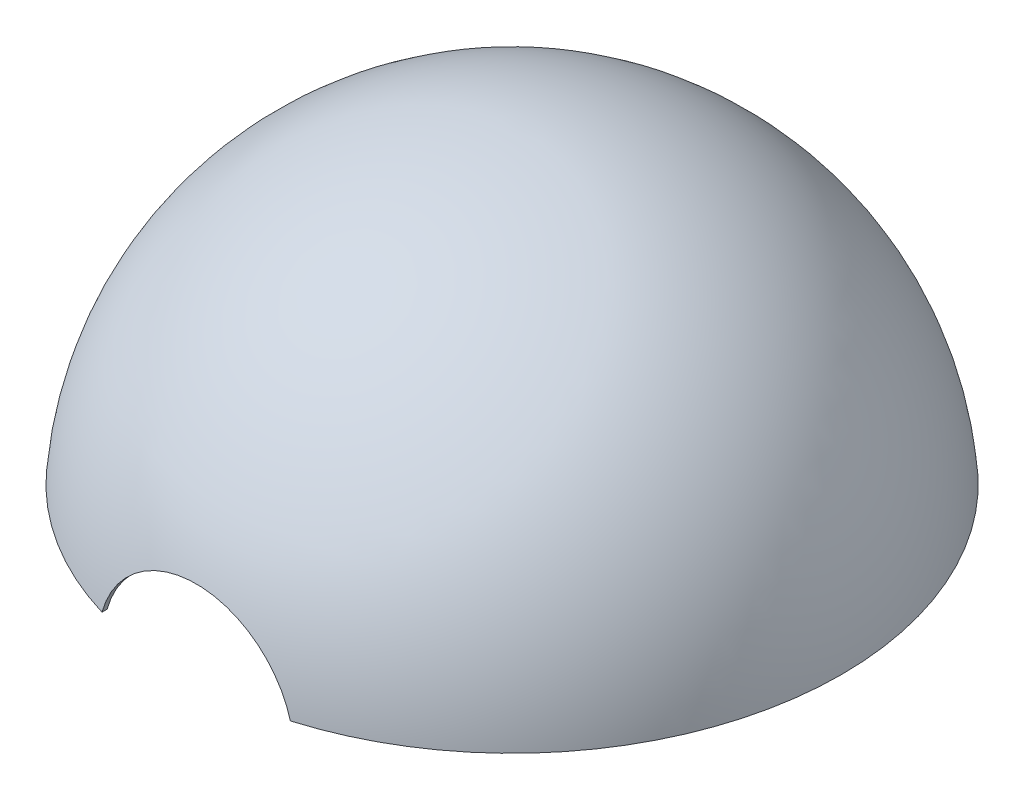
ISO-10303-21;
HEADER;
FILE_DESCRIPTION(('STEP AP214'),'2;1');
FILE_NAME('part.step','',(''),(''),'','','');
FILE_SCHEMA(('AUTOMOTIVE_DESIGN { 1 0 10303 214 1 1 1 1 }'));
ENDSEC;
DATA;
#1=APPLICATION_CONTEXT('core data for automotive mechanical design processes');
#2=APPLICATION_PROTOCOL_DEFINITION('international standard','automotive_design',2000,#1);
#3=PRODUCT_CONTEXT('',#1,'mechanical');
#4=PRODUCT('Part','Part','',(#3));
#5=PRODUCT_RELATED_PRODUCT_CATEGORY('part','',(#4));
#6=PRODUCT_DEFINITION_FORMATION('','',#4);
#7=PRODUCT_DEFINITION_CONTEXT('part definition',#1,'design');
#8=PRODUCT_DEFINITION('design','',#6,#7);
#9=PRODUCT_DEFINITION_SHAPE('','',#8);
#10=(LENGTH_UNIT() NAMED_UNIT(*) SI_UNIT(.MILLI.,.METRE.));
#11=(NAMED_UNIT(*) PLANE_ANGLE_UNIT() SI_UNIT($,.RADIAN.));
#12=(NAMED_UNIT(*) SI_UNIT($,.STERADIAN.) SOLID_ANGLE_UNIT());
#13=UNCERTAINTY_MEASURE_WITH_UNIT(LENGTH_MEASURE(1.E-05),#10,'distance_accuracy_value','');
#14=(GEOMETRIC_REPRESENTATION_CONTEXT(3) GLOBAL_UNCERTAINTY_ASSIGNED_CONTEXT((#13)) GLOBAL_UNIT_ASSIGNED_CONTEXT((#10,
#11,#12)) REPRESENTATION_CONTEXT('',''));
#15=CARTESIAN_POINT('',(0.,0.,0.));
#16=DIRECTION('',(0.,0.,1.));
#17=DIRECTION('',(1.,0.,0.));
#18=AXIS2_PLACEMENT_3D('',#15,#16,#17);
#19=CARTESIAN_POINT('',(0.,0.,0.));
#20=DIRECTION('',(0.,-1.,0.));
#21=DIRECTION('',(1.,0.,0.));
#22=AXIS2_PLACEMENT_3D('',#19,#20,#21);
#23=SPHERICAL_SURFACE('',#22,25.);
#24=CARTESIAN_POINT('',(0.,2.,0.));
#25=DIRECTION('',(0.,-1.,0.));
#26=DIRECTION('',(0.,0.,-1.));
#27=AXIS2_PLACEMENT_3D('',#24,#25,#26);
#28=CIRCLE('',#27,24.9198715887542);
#29=CARTESIAN_POINT('',(-7.22841614740048,2.,23.8484800354236));
#30=VERTEX_POINT('',#29);
#31=CARTESIAN_POINT('',(7.22841614740048,2.,23.8484800354236));
#32=VERTEX_POINT('',#31);
#33=EDGE_CURVE('E40',#30,#32,#28,.T.);
#34=ORIENTED_EDGE('',*,*,#33,.T.);
#35=CARTESIAN_POINT('',(0.,0.,23.8484800354236));
#36=DIRECTION('',(0.,0.,-1.));
#37=DIRECTION('',(-1.,0.,0.));
#38=AXIS2_PLACEMENT_3D('',#35,#36,#37);
#39=CIRCLE('',#38,7.5);
#40=EDGE_CURVE('E65',#32,#30,#39,.F.);
#41=ORIENTED_EDGE('',*,*,#40,.T.);
#42=EDGE_LOOP('',(#34,#41));
#43=FACE_BOUND('',#42,.T.);
#44=ADVANCED_FACE('F33',(#43),#23,.F.);
#45=CARTESIAN_POINT('',(24.9198715887542,2.,0.));
#46=DIRECTION('',(0.,-1.,0.));
#47=DIRECTION('',(0.,0.,-1.));
#48=AXIS2_PLACEMENT_3D('',#45,#46,#47);
#49=PLANE('',#48);
#50=ORIENTED_EDGE('',*,*,#33,.F.);
#51=DIRECTION('',(0.,0.,-1.));
#52=VECTOR('',#51,1.);
#53=CARTESIAN_POINT('',(-7.22841614740048,2.,25.2960594757365));
#54=LINE('',#53,#52);
#55=CARTESIAN_POINT('',(-7.22841614740048,2.,24.2412999857681));
#56=VERTEX_POINT('',#55);
#57=EDGE_CURVE('E51',#30,#56,#54,.F.);
#58=ORIENTED_EDGE('',*,*,#57,.T.);
#59=CARTESIAN_POINT('',(0.,2.,0.));
#60=DIRECTION('',(0.,-1.,0.));
#61=DIRECTION('',(0.,0.,-1.));
#62=AXIS2_PLACEMENT_3D('',#59,#60,#61);
#63=CIRCLE('',#62,25.2960594757365);
#64=CARTESIAN_POINT('',(7.22841614740048,2.,24.2412999857681));
#65=VERTEX_POINT('',#64);
#66=EDGE_CURVE('E63',#56,#65,#63,.T.);
#67=ORIENTED_EDGE('',*,*,#66,.T.);
#68=DIRECTION('',(0.,0.,-1.));
#69=VECTOR('',#68,1.);
#70=CARTESIAN_POINT('',(7.22841614740048,2.,25.2960594757365));
#71=LINE('',#70,#69);
#72=EDGE_CURVE('E47',#65,#32,#71,.T.);
#73=ORIENTED_EDGE('',*,*,#72,.T.);
#74=EDGE_LOOP('',(#50,#58,#67,#73));
#75=FACE_BOUND('',#74,.T.);
#76=ADVANCED_FACE('F62',(#75),#49,.T.);
#77=CARTESIAN_POINT('',(0.,0.,0.));
#78=DIRECTION('',(0.,-1.,0.));
#79=DIRECTION('',(1.,0.,0.));
#80=AXIS2_PLACEMENT_3D('',#77,#78,#79);
#81=SPHERICAL_SURFACE('',#80,25.375);
#82=ORIENTED_EDGE('',*,*,#66,.F.);
#83=CARTESIAN_POINT('',(0.,0.,24.2412999857681));
#84=DIRECTION('',(0.,0.,-1.));
#85=DIRECTION('',(-1.,0.,0.));
#86=AXIS2_PLACEMENT_3D('',#83,#84,#85);
#87=CIRCLE('',#86,7.5);
#88=EDGE_CURVE('E11',#56,#65,#87,.T.);
#89=ORIENTED_EDGE('',*,*,#88,.T.);
#90=EDGE_LOOP('',(#82,#89));
#91=FACE_BOUND('',#90,.T.);
#92=ADVANCED_FACE('F67',(#91),#81,.T.);
#93=CARTESIAN_POINT('',(0.,0.,25.2960594757365));
#94=DIRECTION('',(0.,0.,-1.));
#95=DIRECTION('',(-1.,0.,0.));
#96=AXIS2_PLACEMENT_3D('',#93,#94,#95);
#97=CYLINDRICAL_SURFACE('',#96,7.5);
#98=ORIENTED_EDGE('',*,*,#72,.F.);
#99=ORIENTED_EDGE('',*,*,#88,.F.);
#100=ORIENTED_EDGE('',*,*,#57,.F.);
#101=ORIENTED_EDGE('',*,*,#40,.F.);
#102=EDGE_LOOP('',(#98,#99,#100,#101));
#103=FACE_BOUND('',#102,.T.);
#104=ADVANCED_FACE('F56',(#103),#97,.F.);
#105=CLOSED_SHELL('',(#44,#76,#92,#104));
#106=MANIFOLD_SOLID_BREP('B2',#105);
#107=ADVANCED_BREP_SHAPE_REPRESENTATION('',(#18,#106),#14);
#108=SHAPE_DEFINITION_REPRESENTATION(#9,#107);
ENDSEC;
END-ISO-10303-21;
